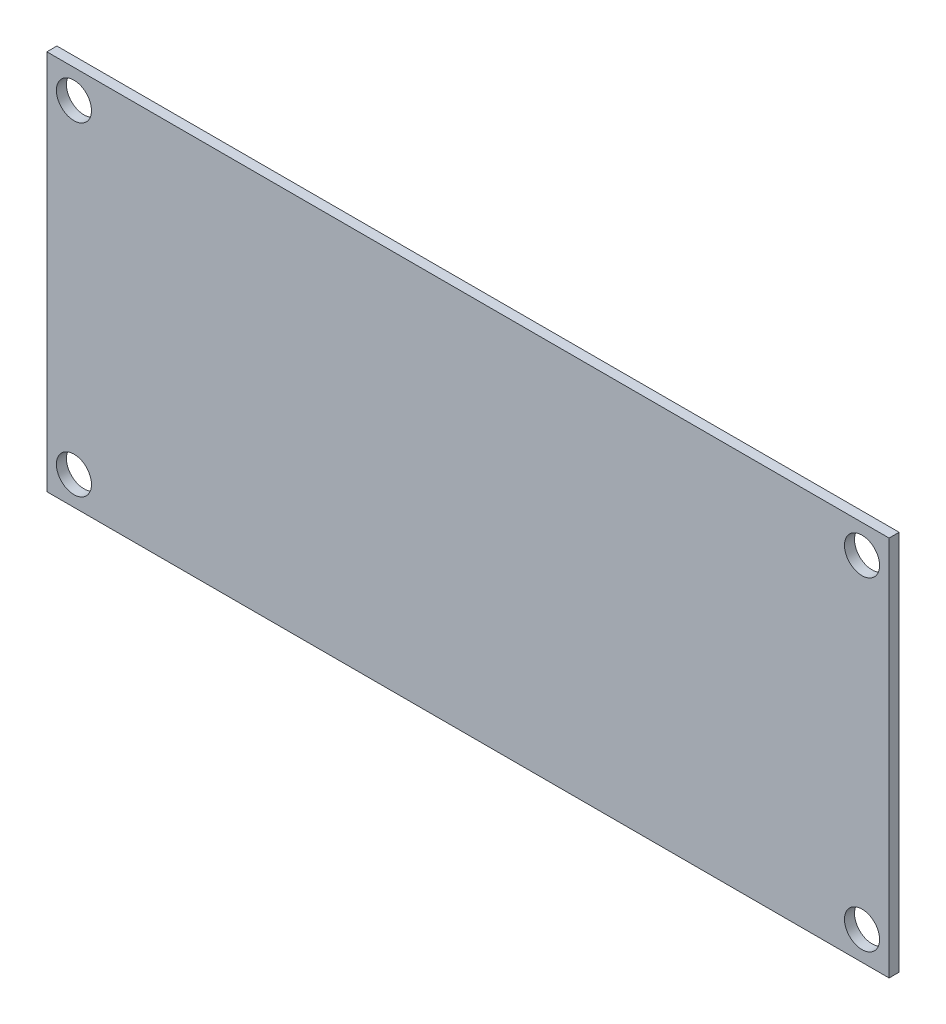
ISO-10303-21;
HEADER;
FILE_DESCRIPTION(('STEP AP214'),'2;1');
FILE_NAME('part.step','',(''),(''),'','','');
FILE_SCHEMA(('AUTOMOTIVE_DESIGN { 1 0 10303 214 1 1 1 1 }'));
ENDSEC;
DATA;
#1=APPLICATION_CONTEXT('core data for automotive mechanical design processes');
#2=APPLICATION_PROTOCOL_DEFINITION('international standard','automotive_design',2000,#1);
#3=PRODUCT_CONTEXT('',#1,'mechanical');
#4=PRODUCT('Part','Part','',(#3));
#5=PRODUCT_RELATED_PRODUCT_CATEGORY('part','',(#4));
#6=PRODUCT_DEFINITION_FORMATION('','',#4);
#7=PRODUCT_DEFINITION_CONTEXT('part definition',#1,'design');
#8=PRODUCT_DEFINITION('design','',#6,#7);
#9=PRODUCT_DEFINITION_SHAPE('','',#8);
#10=(LENGTH_UNIT() NAMED_UNIT(*) SI_UNIT(.MILLI.,.METRE.));
#11=(NAMED_UNIT(*) PLANE_ANGLE_UNIT() SI_UNIT($,.RADIAN.));
#12=(NAMED_UNIT(*) SI_UNIT($,.STERADIAN.) SOLID_ANGLE_UNIT());
#13=UNCERTAINTY_MEASURE_WITH_UNIT(LENGTH_MEASURE(1.E-05),#10,'distance_accuracy_value','');
#14=(GEOMETRIC_REPRESENTATION_CONTEXT(3) GLOBAL_UNCERTAINTY_ASSIGNED_CONTEXT((#13)) GLOBAL_UNIT_ASSIGNED_CONTEXT((#10,
#11,#12)) REPRESENTATION_CONTEXT('',''));
#15=CARTESIAN_POINT('',(0.,0.,0.));
#16=DIRECTION('',(0.,0.,1.));
#17=DIRECTION('',(1.,0.,0.));
#18=AXIS2_PLACEMENT_3D('',#15,#16,#17);
#19=CARTESIAN_POINT('',(0.,0.,1.));
#20=DIRECTION('',(0.,0.,-1.));
#21=DIRECTION('',(-1.,0.,0.));
#22=AXIS2_PLACEMENT_3D('',#19,#20,#21);
#23=PLANE('',#22);
#24=DIRECTION('',(0.,1.,0.));
#25=VECTOR('',#24,1.);
#26=CARTESIAN_POINT('',(42.,-19.,1.));
#27=LINE('',#26,#25);
#28=CARTESIAN_POINT('',(42.,-19.,1.));
#29=VERTEX_POINT('',#28);
#30=CARTESIAN_POINT('',(42.,19.,1.));
#31=VERTEX_POINT('',#30);
#32=EDGE_CURVE('E87',#29,#31,#27,.T.);
#33=ORIENTED_EDGE('',*,*,#32,.T.);
#34=DIRECTION('',(-1.,0.,0.));
#35=VECTOR('',#34,1.);
#36=CARTESIAN_POINT('',(-42.,19.,1.));
#37=LINE('',#36,#35);
#38=CARTESIAN_POINT('',(-42.,19.,1.));
#39=VERTEX_POINT('',#38);
#40=EDGE_CURVE('E82',#31,#39,#37,.T.);
#41=ORIENTED_EDGE('',*,*,#40,.T.);
#42=DIRECTION('',(0.,-1.,0.));
#43=VECTOR('',#42,1.);
#44=CARTESIAN_POINT('',(-42.,-19.,1.));
#45=LINE('',#44,#43);
#46=CARTESIAN_POINT('',(-42.,-19.,1.));
#47=VERTEX_POINT('',#46);
#48=EDGE_CURVE('E85',#39,#47,#45,.T.);
#49=ORIENTED_EDGE('',*,*,#48,.T.);
#50=DIRECTION('',(1.,0.,0.));
#51=VECTOR('',#50,1.);
#52=CARTESIAN_POINT('',(-42.,-19.,1.));
#53=LINE('',#52,#51);
#54=EDGE_CURVE('E52',#47,#29,#53,.T.);
#55=ORIENTED_EDGE('',*,*,#54,.T.);
#56=EDGE_LOOP('',(#33,#41,#49,#55));
#57=FACE_BOUND('',#56,.T.);
#58=CARTESIAN_POINT('',(-39.3,16.15,1.));
#59=DIRECTION('',(0.,0.,1.));
#60=DIRECTION('',(1.,0.,0.));
#61=AXIS2_PLACEMENT_3D('',#58,#59,#60);
#62=CIRCLE('',#61,1.75);
#63=CARTESIAN_POINT('',(-37.55,16.15,1.));
#64=VERTEX_POINT('',#63);
#65=EDGE_CURVE('E102',#64,#64,#62,.T.);
#66=ORIENTED_EDGE('',*,*,#65,.F.);
#67=EDGE_LOOP('',(#66));
#68=FACE_BOUND('',#67,.T.);
#69=CARTESIAN_POINT('',(39.3,16.15,1.));
#70=DIRECTION('',(0.,0.,1.));
#71=DIRECTION('',(1.,0.,0.));
#72=AXIS2_PLACEMENT_3D('',#69,#70,#71);
#73=CIRCLE('',#72,1.75);
#74=CARTESIAN_POINT('',(41.05,16.15,1.));
#75=VERTEX_POINT('',#74);
#76=EDGE_CURVE('E117',#75,#75,#73,.T.);
#77=ORIENTED_EDGE('',*,*,#76,.F.);
#78=EDGE_LOOP('',(#77));
#79=FACE_BOUND('',#78,.T.);
#80=CARTESIAN_POINT('',(-39.3,-16.15,1.));
#81=DIRECTION('',(0.,0.,1.));
#82=DIRECTION('',(1.,0.,0.));
#83=AXIS2_PLACEMENT_3D('',#80,#81,#82);
#84=CIRCLE('',#83,1.75);
#85=CARTESIAN_POINT('',(-37.55,-16.15,1.));
#86=VERTEX_POINT('',#85);
#87=EDGE_CURVE('E123',#86,#86,#84,.T.);
#88=ORIENTED_EDGE('',*,*,#87,.F.);
#89=EDGE_LOOP('',(#88));
#90=FACE_BOUND('',#89,.T.);
#91=CARTESIAN_POINT('',(39.3,-16.15,1.));
#92=DIRECTION('',(0.,0.,1.));
#93=DIRECTION('',(1.,0.,0.));
#94=AXIS2_PLACEMENT_3D('',#91,#92,#93);
#95=CIRCLE('',#94,1.75);
#96=CARTESIAN_POINT('',(41.05,-16.15,1.));
#97=VERTEX_POINT('',#96);
#98=EDGE_CURVE('E129',#97,#97,#95,.T.);
#99=ORIENTED_EDGE('',*,*,#98,.F.);
#100=EDGE_LOOP('',(#99));
#101=FACE_BOUND('',#100,.T.);
#102=ADVANCED_FACE('F35',(#57,#68,#79,#90,#101),#23,.F.);
#103=CARTESIAN_POINT('',(0.,0.,0.));
#104=DIRECTION('',(0.,0.,-1.));
#105=DIRECTION('',(-1.,0.,0.));
#106=AXIS2_PLACEMENT_3D('',#103,#104,#105);
#107=PLANE('',#106);
#108=CARTESIAN_POINT('',(-39.3,-16.15,0.));
#109=DIRECTION('',(0.,0.,1.));
#110=DIRECTION('',(1.,0.,0.));
#111=AXIS2_PLACEMENT_3D('',#108,#109,#110);
#112=CIRCLE('',#111,1.75);
#113=CARTESIAN_POINT('',(-37.55,-16.15,0.));
#114=VERTEX_POINT('',#113);
#115=EDGE_CURVE('E126',#114,#114,#112,.T.);
#116=ORIENTED_EDGE('',*,*,#115,.T.);
#117=EDGE_LOOP('',(#116));
#118=FACE_BOUND('',#117,.T.);
#119=CARTESIAN_POINT('',(-39.3,16.15,0.));
#120=DIRECTION('',(0.,0.,1.));
#121=DIRECTION('',(1.,0.,0.));
#122=AXIS2_PLACEMENT_3D('',#119,#120,#121);
#123=CIRCLE('',#122,1.75);
#124=CARTESIAN_POINT('',(-37.55,16.15,0.));
#125=VERTEX_POINT('',#124);
#126=EDGE_CURVE('E114',#125,#125,#123,.T.);
#127=ORIENTED_EDGE('',*,*,#126,.T.);
#128=EDGE_LOOP('',(#127));
#129=FACE_BOUND('',#128,.T.);
#130=DIRECTION('',(0.,1.,0.));
#131=VECTOR('',#130,1.);
#132=CARTESIAN_POINT('',(42.,-19.,0.));
#133=LINE('',#132,#131);
#134=CARTESIAN_POINT('',(42.,-19.,0.));
#135=VERTEX_POINT('',#134);
#136=CARTESIAN_POINT('',(42.,19.,0.));
#137=VERTEX_POINT('',#136);
#138=EDGE_CURVE('E99',#135,#137,#133,.T.);
#139=ORIENTED_EDGE('',*,*,#138,.F.);
#140=DIRECTION('',(1.,0.,0.));
#141=VECTOR('',#140,1.);
#142=CARTESIAN_POINT('',(-42.,-19.,0.));
#143=LINE('',#142,#141);
#144=CARTESIAN_POINT('',(-42.,-19.,0.));
#145=VERTEX_POINT('',#144);
#146=EDGE_CURVE('E75',#145,#135,#143,.T.);
#147=ORIENTED_EDGE('',*,*,#146,.F.);
#148=DIRECTION('',(0.,-1.,0.));
#149=VECTOR('',#148,1.);
#150=CARTESIAN_POINT('',(-42.,-19.,0.));
#151=LINE('',#150,#149);
#152=CARTESIAN_POINT('',(-42.,19.,0.));
#153=VERTEX_POINT('',#152);
#154=EDGE_CURVE('E69',#153,#145,#151,.T.);
#155=ORIENTED_EDGE('',*,*,#154,.F.);
#156=DIRECTION('',(-1.,0.,0.));
#157=VECTOR('',#156,1.);
#158=CARTESIAN_POINT('',(-42.,19.,0.));
#159=LINE('',#158,#157);
#160=EDGE_CURVE('E91',#137,#153,#159,.T.);
#161=ORIENTED_EDGE('',*,*,#160,.F.);
#162=EDGE_LOOP('',(#139,#147,#155,#161));
#163=FACE_BOUND('',#162,.T.);
#164=CARTESIAN_POINT('',(39.3,16.15,0.));
#165=DIRECTION('',(0.,0.,1.));
#166=DIRECTION('',(1.,0.,0.));
#167=AXIS2_PLACEMENT_3D('',#164,#165,#166);
#168=CIRCLE('',#167,1.75);
#169=CARTESIAN_POINT('',(41.05,16.15,0.));
#170=VERTEX_POINT('',#169);
#171=EDGE_CURVE('E120',#170,#170,#168,.T.);
#172=ORIENTED_EDGE('',*,*,#171,.T.);
#173=EDGE_LOOP('',(#172));
#174=FACE_BOUND('',#173,.T.);
#175=CARTESIAN_POINT('',(39.3,-16.15,0.));
#176=DIRECTION('',(0.,0.,1.));
#177=DIRECTION('',(1.,0.,0.));
#178=AXIS2_PLACEMENT_3D('',#175,#176,#177);
#179=CIRCLE('',#178,1.75);
#180=CARTESIAN_POINT('',(41.05,-16.15,0.));
#181=VERTEX_POINT('',#180);
#182=EDGE_CURVE('E132',#181,#181,#179,.T.);
#183=ORIENTED_EDGE('',*,*,#182,.T.);
#184=EDGE_LOOP('',(#183));
#185=FACE_BOUND('',#184,.T.);
#186=ADVANCED_FACE('F110',(#118,#129,#163,#174,#185),#107,.T.);
#187=CARTESIAN_POINT('',(42.,-19.,1.));
#188=DIRECTION('',(-1.,0.,0.));
#189=DIRECTION('',(0.,0.,1.));
#190=AXIS2_PLACEMENT_3D('',#187,#188,#189);
#191=PLANE('',#190);
#192=ORIENTED_EDGE('',*,*,#138,.T.);
#193=DIRECTION('',(0.,0.,-1.));
#194=VECTOR('',#193,1.);
#195=CARTESIAN_POINT('',(42.,19.,1.));
#196=LINE('',#195,#194);
#197=EDGE_CURVE('E11',#31,#137,#196,.T.);
#198=ORIENTED_EDGE('',*,*,#197,.F.);
#199=ORIENTED_EDGE('',*,*,#32,.F.);
#200=DIRECTION('',(0.,0.,-1.));
#201=VECTOR('',#200,1.);
#202=CARTESIAN_POINT('',(42.,-19.,1.));
#203=LINE('',#202,#201);
#204=EDGE_CURVE('E95',#29,#135,#203,.T.);
#205=ORIENTED_EDGE('',*,*,#204,.T.);
#206=EDGE_LOOP('',(#192,#198,#199,#205));
#207=FACE_BOUND('',#206,.T.);
#208=ADVANCED_FACE('F37',(#207),#191,.F.);
#209=CARTESIAN_POINT('',(-42.,19.,1.));
#210=DIRECTION('',(0.,-1.,0.));
#211=DIRECTION('',(0.,0.,-1.));
#212=AXIS2_PLACEMENT_3D('',#209,#210,#211);
#213=PLANE('',#212);
#214=ORIENTED_EDGE('',*,*,#160,.T.);
#215=DIRECTION('',(0.,0.,-1.));
#216=VECTOR('',#215,1.);
#217=CARTESIAN_POINT('',(-42.,19.,1.));
#218=LINE('',#217,#216);
#219=EDGE_CURVE('E44',#39,#153,#218,.T.);
#220=ORIENTED_EDGE('',*,*,#219,.F.);
#221=ORIENTED_EDGE('',*,*,#40,.F.);
#222=ORIENTED_EDGE('',*,*,#197,.T.);
#223=EDGE_LOOP('',(#214,#220,#221,#222));
#224=FACE_BOUND('',#223,.T.);
#225=ADVANCED_FACE('F90',(#224),#213,.F.);
#226=CARTESIAN_POINT('',(-42.,-19.,1.));
#227=DIRECTION('',(1.,0.,0.));
#228=DIRECTION('',(0.,0.,-1.));
#229=AXIS2_PLACEMENT_3D('',#226,#227,#228);
#230=PLANE('',#229);
#231=ORIENTED_EDGE('',*,*,#154,.T.);
#232=DIRECTION('',(0.,0.,-1.));
#233=VECTOR('',#232,1.);
#234=CARTESIAN_POINT('',(-42.,-19.,1.));
#235=LINE('',#234,#233);
#236=EDGE_CURVE('E92',#47,#145,#235,.T.);
#237=ORIENTED_EDGE('',*,*,#236,.F.);
#238=ORIENTED_EDGE('',*,*,#48,.F.);
#239=ORIENTED_EDGE('',*,*,#219,.T.);
#240=EDGE_LOOP('',(#231,#237,#238,#239));
#241=FACE_BOUND('',#240,.T.);
#242=ADVANCED_FACE('F93',(#241),#230,.F.);
#243=CARTESIAN_POINT('',(-42.,-19.,1.));
#244=DIRECTION('',(0.,1.,0.));
#245=DIRECTION('',(0.,0.,1.));
#246=AXIS2_PLACEMENT_3D('',#243,#244,#245);
#247=PLANE('',#246);
#248=ORIENTED_EDGE('',*,*,#146,.T.);
#249=ORIENTED_EDGE('',*,*,#204,.F.);
#250=ORIENTED_EDGE('',*,*,#54,.F.);
#251=ORIENTED_EDGE('',*,*,#236,.T.);
#252=EDGE_LOOP('',(#248,#249,#250,#251));
#253=FACE_BOUND('',#252,.T.);
#254=ADVANCED_FACE('F107',(#253),#247,.F.);
#255=CARTESIAN_POINT('',(-39.3,16.15,1.));
#256=DIRECTION('',(0.,0.,-1.));
#257=DIRECTION('',(-1.,0.,0.));
#258=AXIS2_PLACEMENT_3D('',#255,#256,#257);
#259=CYLINDRICAL_SURFACE('',#258,1.75);
#260=ORIENTED_EDGE('',*,*,#65,.T.);
#261=EDGE_LOOP('',(#260));
#262=FACE_BOUND('',#261,.T.);
#263=ORIENTED_EDGE('',*,*,#126,.F.);
#264=EDGE_LOOP('',(#263));
#265=FACE_BOUND('',#264,.T.);
#266=ADVANCED_FACE('F149',(#262,#265),#259,.F.);
#267=CARTESIAN_POINT('',(39.3,16.15,1.));
#268=DIRECTION('',(0.,0.,-1.));
#269=DIRECTION('',(-1.,0.,0.));
#270=AXIS2_PLACEMENT_3D('',#267,#268,#269);
#271=CYLINDRICAL_SURFACE('',#270,1.75);
#272=ORIENTED_EDGE('',*,*,#76,.T.);
#273=EDGE_LOOP('',(#272));
#274=FACE_BOUND('',#273,.T.);
#275=ORIENTED_EDGE('',*,*,#171,.F.);
#276=EDGE_LOOP('',(#275));
#277=FACE_BOUND('',#276,.T.);
#278=ADVANCED_FACE('F195',(#274,#277),#271,.F.);
#279=CARTESIAN_POINT('',(-39.3,-16.15,1.));
#280=DIRECTION('',(0.,0.,-1.));
#281=DIRECTION('',(-1.,0.,0.));
#282=AXIS2_PLACEMENT_3D('',#279,#280,#281);
#283=CYLINDRICAL_SURFACE('',#282,1.75);
#284=ORIENTED_EDGE('',*,*,#87,.T.);
#285=EDGE_LOOP('',(#284));
#286=FACE_BOUND('',#285,.T.);
#287=ORIENTED_EDGE('',*,*,#115,.F.);
#288=EDGE_LOOP('',(#287));
#289=FACE_BOUND('',#288,.T.);
#290=ADVANCED_FACE('F203',(#286,#289),#283,.F.);
#291=CARTESIAN_POINT('',(39.3,-16.15,1.));
#292=DIRECTION('',(0.,0.,-1.));
#293=DIRECTION('',(-1.,0.,0.));
#294=AXIS2_PLACEMENT_3D('',#291,#292,#293);
#295=CYLINDRICAL_SURFACE('',#294,1.75);
#296=ORIENTED_EDGE('',*,*,#98,.T.);
#297=EDGE_LOOP('',(#296));
#298=FACE_BOUND('',#297,.T.);
#299=ORIENTED_EDGE('',*,*,#182,.F.);
#300=EDGE_LOOP('',(#299));
#301=FACE_BOUND('',#300,.T.);
#302=ADVANCED_FACE('F138',(#298,#301),#295,.F.);
#303=CLOSED_SHELL('',(#102,#186,#208,#225,#242,#254,#266,#278,#290,#302));
#304=MANIFOLD_SOLID_BREP('B2',#303);
#305=ADVANCED_BREP_SHAPE_REPRESENTATION('',(#18,#304),#14);
#306=SHAPE_DEFINITION_REPRESENTATION(#9,#305);
ENDSEC;
END-ISO-10303-21;
